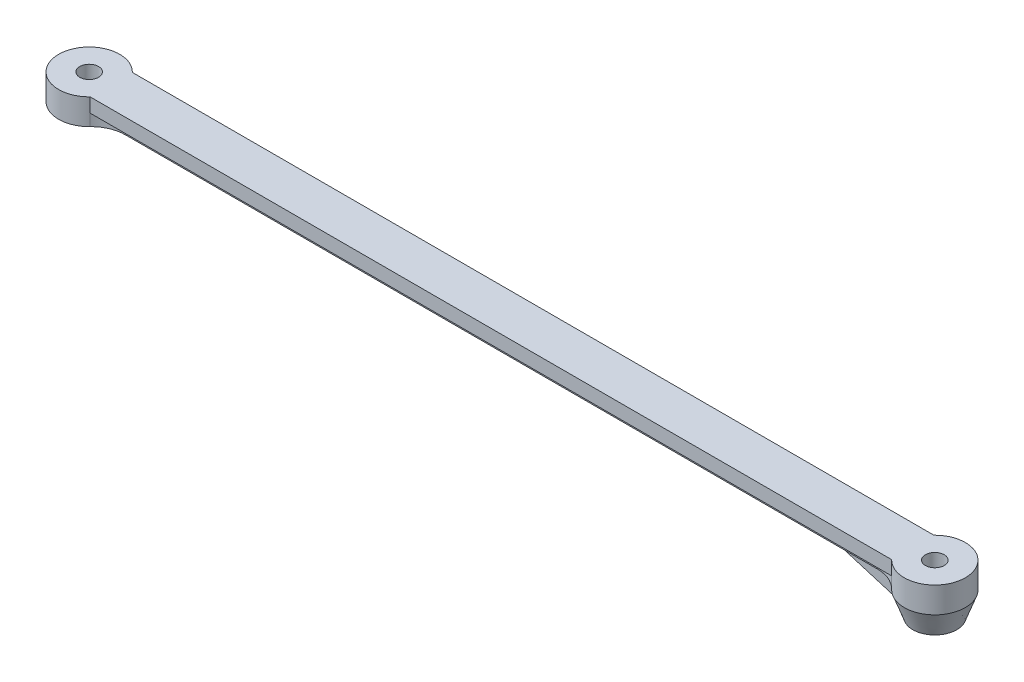
ISO-10303-21;
HEADER;
FILE_DESCRIPTION(('STEP AP214'),'2;1');
FILE_NAME('part.step','',(''),(''),'','','');
FILE_SCHEMA(('AUTOMOTIVE_DESIGN { 1 0 10303 214 1 1 1 1 }'));
ENDSEC;
DATA;
#1=APPLICATION_CONTEXT('core data for automotive mechanical design processes');
#2=APPLICATION_PROTOCOL_DEFINITION('international standard','automotive_design',2000,#1);
#3=PRODUCT_CONTEXT('',#1,'mechanical');
#4=PRODUCT('Part','Part','',(#3));
#5=PRODUCT_RELATED_PRODUCT_CATEGORY('part','',(#4));
#6=PRODUCT_DEFINITION_FORMATION('','',#4);
#7=PRODUCT_DEFINITION_CONTEXT('part definition',#1,'design');
#8=PRODUCT_DEFINITION('design','',#6,#7);
#9=PRODUCT_DEFINITION_SHAPE('','',#8);
#10=(LENGTH_UNIT() NAMED_UNIT(*) SI_UNIT(.MILLI.,.METRE.));
#11=(NAMED_UNIT(*) PLANE_ANGLE_UNIT() SI_UNIT($,.RADIAN.));
#12=(NAMED_UNIT(*) SI_UNIT($,.STERADIAN.) SOLID_ANGLE_UNIT());
#13=UNCERTAINTY_MEASURE_WITH_UNIT(LENGTH_MEASURE(1.E-05),#10,'distance_accuracy_value','');
#14=(GEOMETRIC_REPRESENTATION_CONTEXT(3) GLOBAL_UNCERTAINTY_ASSIGNED_CONTEXT((#13)) GLOBAL_UNIT_ASSIGNED_CONTEXT((#10,
#11,#12)) REPRESENTATION_CONTEXT('',''));
#15=CARTESIAN_POINT('',(0.,0.,0.));
#16=DIRECTION('',(0.,0.,1.));
#17=DIRECTION('',(1.,0.,0.));
#18=AXIS2_PLACEMENT_3D('',#15,#16,#17);
#19=CARTESIAN_POINT('',(-180.,0.,0.));
#20=DIRECTION('',(0.,1.,0.));
#21=DIRECTION('',(0.,0.,1.));
#22=AXIS2_PLACEMENT_3D('',#19,#20,#21);
#23=PLANE('',#22);
#24=CARTESIAN_POINT('',(-180.,0.,0.));
#25=DIRECTION('',(0.,1.,0.));
#26=DIRECTION('',(0.,0.,1.));
#27=AXIS2_PLACEMENT_3D('',#24,#25,#26);
#28=CIRCLE('',#27,2.);
#29=CARTESIAN_POINT('',(-180.,0.,2.));
#30=VERTEX_POINT('',#29);
#31=EDGE_CURVE('E262',#30,#30,#28,.T.);
#32=ORIENTED_EDGE('',*,*,#31,.T.);
#33=EDGE_LOOP('',(#32));
#34=FACE_BOUND('',#33,.T.);
#35=DIRECTION('',(-1.,0.,0.));
#36=VECTOR('',#35,1.);
#37=CARTESIAN_POINT('',(-3.08000003216462,0.,1.25));
#38=LINE('',#37,#36);
#39=CARTESIAN_POINT('',(-6.37929922012124,0.,1.25000003393927));
#40=VERTEX_POINT('',#39);
#41=CARTESIAN_POINT('',(-21.2800000321646,0.,1.25));
#42=VERTEX_POINT('',#41);
#43=EDGE_CURVE('E153',#40,#42,#38,.T.);
#44=ORIENTED_EDGE('',*,*,#43,.F.);
#45=CARTESIAN_POINT('',(0.,0.,0.));
#46=DIRECTION('',(0.,-1.,0.));
#47=DIRECTION('',(0.,0.,-1.));
#48=AXIS2_PLACEMENT_3D('',#45,#46,#47);
#49=CIRCLE('',#48,6.50000000000002);
#50=CARTESIAN_POINT('',(-4.69109029053926,0.,4.49929458046569));
#51=VERTEX_POINT('',#50);
#52=EDGE_CURVE('E231',#51,#40,#49,.T.);
#53=ORIENTED_EDGE('',*,*,#52,.F.);
#54=CARTESIAN_POINT('',(-9.96713348962479,0.,9.56249999999999));
#55=DIRECTION('',(0.,-1.,0.));
#56=DIRECTION('',(0.,0.,1.));
#57=AXIS2_PLACEMENT_3D('',#54,#55,#56);
#58=CIRCLE('',#57,7.3125);
#59=CARTESIAN_POINT('',(-9.9671334896248,0.,2.24999999999998));
#60=VERTEX_POINT('',#59);
#61=EDGE_CURVE('E257',#60,#51,#58,.T.);
#62=ORIENTED_EDGE('',*,*,#61,.F.);
#63=DIRECTION('',(1.,0.,0.));
#64=VECTOR('',#63,1.);
#65=CARTESIAN_POINT('',(-9.9671334896248,0.,2.24999999999998));
#66=LINE('',#65,#64);
#67=CARTESIAN_POINT('',(-170.032866510375,0.,2.24999999999999));
#68=VERTEX_POINT('',#67);
#69=EDGE_CURVE('E244',#68,#60,#66,.T.);
#70=ORIENTED_EDGE('',*,*,#69,.F.);
#71=CARTESIAN_POINT('',(-170.032866510375,0.,9.56250000000001));
#72=DIRECTION('',(0.,-1.,0.));
#73=DIRECTION('',(0.,0.,-1.));
#74=AXIS2_PLACEMENT_3D('',#71,#72,#73);
#75=CIRCLE('',#74,7.31250000000002);
#76=CARTESIAN_POINT('',(-175.309584240177,0.,4.49999999999997));
#77=VERTEX_POINT('',#76);
#78=EDGE_CURVE('E254',#77,#68,#75,.T.);
#79=ORIENTED_EDGE('',*,*,#78,.F.);
#80=CARTESIAN_POINT('',(-180.,0.,0.));
#81=DIRECTION('',(0.,1.,0.));
#82=DIRECTION('',(0.,0.,1.));
#83=AXIS2_PLACEMENT_3D('',#80,#81,#82);
#84=CIRCLE('',#83,6.5);
#85=CARTESIAN_POINT('',(-175.309584240177,0.,-4.5));
#86=VERTEX_POINT('',#85);
#87=EDGE_CURVE('E300',#86,#77,#84,.T.);
#88=ORIENTED_EDGE('',*,*,#87,.F.);
#89=CARTESIAN_POINT('',(-170.032866510375,0.,-9.56250000000001));
#90=DIRECTION('',(0.,-1.,0.));
#91=DIRECTION('',(0.,0.,1.));
#92=AXIS2_PLACEMENT_3D('',#89,#90,#91);
#93=CIRCLE('',#92,7.31249999999999);
#94=CARTESIAN_POINT('',(-170.032866510375,0.,-2.25000000000002));
#95=VERTEX_POINT('',#94);
#96=EDGE_CURVE('E271',#95,#86,#93,.T.);
#97=ORIENTED_EDGE('',*,*,#96,.F.);
#98=DIRECTION('',(-1.,0.,0.));
#99=VECTOR('',#98,1.);
#100=CARTESIAN_POINT('',(-9.96713348962481,0.,-2.25));
#101=LINE('',#100,#99);
#102=CARTESIAN_POINT('',(-9.96713348962481,0.,-2.25));
#103=VERTEX_POINT('',#102);
#104=EDGE_CURVE('E280',#103,#95,#101,.T.);
#105=ORIENTED_EDGE('',*,*,#104,.F.);
#106=CARTESIAN_POINT('',(-9.96713348962481,0.,-9.56250000000001));
#107=DIRECTION('',(0.,-1.,0.));
#108=DIRECTION('',(0.,0.,-1.));
#109=AXIS2_PLACEMENT_3D('',#106,#107,#108);
#110=CIRCLE('',#109,7.3125);
#111=CARTESIAN_POINT('',(-4.69043967413095,0.,-4.5000230141672));
#112=VERTEX_POINT('',#111);
#113=EDGE_CURVE('E283',#112,#103,#110,.T.);
#114=ORIENTED_EDGE('',*,*,#113,.F.);
#115=CARTESIAN_POINT('',(-6.37929766491854,0.,-1.24999989519081));
#116=VERTEX_POINT('',#115);
#117=EDGE_CURVE('E441',#116,#112,#49,.T.);
#118=ORIENTED_EDGE('',*,*,#117,.F.);
#119=DIRECTION('',(-1.,0.,0.));
#120=VECTOR('',#119,1.);
#121=CARTESIAN_POINT('',(-3.08000003216462,0.,-1.25));
#122=LINE('',#121,#120);
#123=CARTESIAN_POINT('',(-21.2800000321646,0.,-1.25));
#124=VERTEX_POINT('',#123);
#125=EDGE_CURVE('E60',#116,#124,#122,.T.);
#126=ORIENTED_EDGE('',*,*,#125,.T.);
#127=DIRECTION('',(0.,0.,-1.));
#128=VECTOR('',#127,1.);
#129=CARTESIAN_POINT('',(-21.2800000321646,0.,1.25));
#130=LINE('',#129,#128);
#131=EDGE_CURVE('E55',#42,#124,#130,.T.);
#132=ORIENTED_EDGE('',*,*,#131,.F.);
#133=EDGE_LOOP('',(#44,#53,#62,#70,#79,#88,#97,#105,#114,#118,#126,#132));
#134=FACE_BOUND('',#133,.T.);
#135=ADVANCED_FACE('F37',(#34,#134),#23,.F.);
#136=CARTESIAN_POINT('',(0.,-5.,0.));
#137=DIRECTION('',(0.,1.,0.));
#138=DIRECTION('',(0.,0.,1.));
#139=AXIS2_PLACEMENT_3D('',#136,#137,#138);
#140=CONICAL_SURFACE('',#139,4.68,0.349092133951805);
#141=ORIENTED_EDGE('',*,*,#52,.T.);
#142=CARTESIAN_POINT('',(-8.61696060219028,6.0636066150433,1.25));
#143=CARTESIAN_POINT('',(-8.43030599871527,5.55613704654127,1.25));
#144=CARTESIAN_POINT('',(-8.24354541919595,5.04870642478064,1.25));
#145=CARTESIAN_POINT('',(-7.86975365586061,4.03394459450432,1.25));
#146=CARTESIAN_POINT('',(-7.68272247191741,3.52661338603547,1.25));
#147=CARTESIAN_POINT('',(-7.12113302336583,2.00479571089433,1.25));
#148=CARTESIAN_POINT('',(-6.74608112908715,0.990491362462012,1.25));
#149=CARTESIAN_POINT('',(-5.99394719096289,-1.03719120662551,1.25));
#150=CARTESIAN_POINT('',(-5.61686546302824,-2.050569544232,1.25));
#151=CARTESIAN_POINT('',(-5.0484047572454,-3.56957808219935,1.25));
#152=CARTESIAN_POINT('',(-4.85844439697906,-4.07573892758262,1.25));
#153=CARTESIAN_POINT('',(-4.47717352196537,-5.08755181557813,1.25));
#154=CARTESIAN_POINT('',(-4.28586300894899,-5.59320385884175,1.25));
#155=CARTESIAN_POINT('',(-3.93533000225117,-6.51421680365429,1.25));
#156=CARTESIAN_POINT('',(-3.77642864896639,-6.92969985763672,1.25));
#157=CARTESIAN_POINT('',(-3.45669672968412,-7.75991555138109,1.25));
#158=CARTESIAN_POINT('',(-3.2958662024499,-8.1746482060289,1.25));
#159=CARTESIAN_POINT('',(-3.05239823007103,-8.79589610952701,1.25));
#160=CARTESIAN_POINT('',(-2.97086853759102,-9.00284523967557,1.25));
#161=CARTESIAN_POINT('',(-2.8068604047672,-9.41636576774358,1.25));
#162=CARTESIAN_POINT('',(-2.7243819711586,-9.62293716833253,1.25));
#163=CARTESIAN_POINT('',(-2.55820566485512,-10.0356052539102,1.25));
#164=CARTESIAN_POINT('',(-2.47450771668625,-10.2417019085957,1.25));
#165=CARTESIAN_POINT('',(-2.30544369253139,-10.6532150643155,1.25));
#166=CARTESIAN_POINT('',(-2.22007757573289,-10.8586315485651,1.25));
#167=CARTESIAN_POINT('',(-2.13365255737588,-11.0636066150433,1.25));
#168=B_SPLINE_CURVE_WITH_KNOTS('',3,(#142,#143,#144,#145,#146,#147,#148,#149,#150,#151,#152,
#153,#154,#155,#156,#157,#158,#159,#160,#161,#162,#163,#164,#165,#166,#167),.UNSPECIFIED.,.F.,
.F.,(4,2,2,2,2,2,2,2,2,2,2,2,4),(0.,1.6221244837254,3.24424973004629,6.48851993690394,
9.73229903789424,11.3541960353339,12.9760909537954,14.3105852786917,15.6450528340919,
16.3123405211941,16.9796234740758,17.6469479010328,18.314288674883),.UNSPECIFIED.);
#169=CARTESIAN_POINT('',(-4.50998168744277,-5.,1.24999907255157));
#170=VERTEX_POINT('',#169);
#171=EDGE_CURVE('E178',#40,#170,#168,.T.);
#172=ORIENTED_EDGE('',*,*,#171,.T.);
#173=CARTESIAN_POINT('',(0.,-5.,0.));
#174=DIRECTION('',(0.,-1.,0.));
#175=DIRECTION('',(0.,0.,-1.));
#176=AXIS2_PLACEMENT_3D('',#173,#174,#175);
#177=CIRCLE('',#176,4.68);
#178=CARTESIAN_POINT('',(-4.509974455259,-5.,-1.25));
#179=VERTEX_POINT('',#178);
#180=EDGE_CURVE('E169',#179,#170,#177,.T.);
#181=ORIENTED_EDGE('',*,*,#180,.F.);
#182=CARTESIAN_POINT('',(-8.61696060219028,6.06360661504331,-1.25));
#183=CARTESIAN_POINT('',(-8.43030599871527,5.55613704654127,-1.25));
#184=CARTESIAN_POINT('',(-8.24354541919595,5.04870642478064,-1.25));
#185=CARTESIAN_POINT('',(-7.86975365586061,4.03394459450432,-1.25));
#186=CARTESIAN_POINT('',(-7.68272247191741,3.52661338603547,-1.25));
#187=CARTESIAN_POINT('',(-7.12113302336583,2.00479571089433,-1.25));
#188=CARTESIAN_POINT('',(-6.74608112908715,0.990491362462013,-1.25));
#189=CARTESIAN_POINT('',(-5.99394719096289,-1.03719120662551,-1.25));
#190=CARTESIAN_POINT('',(-5.61686546302824,-2.050569544232,-1.25));
#191=CARTESIAN_POINT('',(-5.04840475724539,-3.56957808219935,-1.25));
#192=CARTESIAN_POINT('',(-4.85844439697906,-4.07573892758262,-1.25));
#193=CARTESIAN_POINT('',(-4.47717352196537,-5.08755181557814,-1.25));
#194=CARTESIAN_POINT('',(-4.28586300894899,-5.59320385884175,-1.25));
#195=CARTESIAN_POINT('',(-3.93533000225117,-6.51421680365429,-1.25));
#196=CARTESIAN_POINT('',(-3.77642864896639,-6.92969985763672,-1.25));
#197=CARTESIAN_POINT('',(-3.45669672968412,-7.75991555138109,-1.25));
#198=CARTESIAN_POINT('',(-3.2958662024499,-8.17464820602891,-1.25));
#199=CARTESIAN_POINT('',(-3.05239823007103,-8.79589610952701,-1.25));
#200=CARTESIAN_POINT('',(-2.97086853759101,-9.00284523967557,-1.25));
#201=CARTESIAN_POINT('',(-2.8068604047672,-9.41636576774359,-1.25));
#202=CARTESIAN_POINT('',(-2.7243819711586,-9.62293716833254,-1.25));
#203=CARTESIAN_POINT('',(-2.55820566485511,-10.0356052539102,-1.25));
#204=CARTESIAN_POINT('',(-2.47450771668625,-10.2417019085957,-1.25));
#205=CARTESIAN_POINT('',(-2.30544369253139,-10.6532150643155,-1.25));
#206=CARTESIAN_POINT('',(-2.22007757573289,-10.8586315485651,-1.25));
#207=CARTESIAN_POINT('',(-2.13365255737588,-11.0636066150433,-1.25));
#208=B_SPLINE_CURVE_WITH_KNOTS('',3,(#182,#183,#184,#185,#186,#187,#188,#189,#190,#191,#192,
#193,#194,#195,#196,#197,#198,#199,#200,#201,#202,#203,#204,#205,#206,#207),.UNSPECIFIED.,.F.,
.F.,(4,2,2,2,2,2,2,2,2,2,2,2,4),(0.,1.6221244837254,3.24424973004629,6.48851993690394,
9.73229903789424,11.3541960353339,12.9760909537954,14.3105852786917,15.645052834092,
16.3123405211941,16.9796234740758,17.6469479010328,18.314288674883),.UNSPECIFIED.);
#209=EDGE_CURVE('E192',#116,#179,#208,.T.);
#210=ORIENTED_EDGE('',*,*,#209,.F.);
#211=ORIENTED_EDGE('',*,*,#117,.T.);
#212=CARTESIAN_POINT('',(0.,0.,0.));
#213=DIRECTION('',(0.,-1.,0.));
#214=DIRECTION('',(0.,0.,-1.));
#215=AXIS2_PLACEMENT_3D('',#212,#213,#214);
#216=CIRCLE('',#215,6.50000000000001);
#217=EDGE_CURVE('E305',#51,#112,#216,.F.);
#218=ORIENTED_EDGE('',*,*,#217,.F.);
#219=EDGE_LOOP('',(#141,#172,#181,#210,#211,#218));
#220=FACE_BOUND('',#219,.T.);
#221=ADVANCED_FACE('F204',(#220),#140,.T.);
#222=CARTESIAN_POINT('',(-175.309584240177,5.5,-4.5));
#223=DIRECTION('',(0.,0.,1.));
#224=DIRECTION('',(1.,0.,0.));
#225=AXIS2_PLACEMENT_3D('',#222,#223,#224);
#226=PLANE('',#225);
#227=DIRECTION('',(1.,0.,0.));
#228=VECTOR('',#227,1.);
#229=CARTESIAN_POINT('',(-175.309584240177,2.5,-4.5));
#230=LINE('',#229,#228);
#231=CARTESIAN_POINT('',(-175.309584240177,2.5,-4.5));
#232=VERTEX_POINT('',#231);
#233=CARTESIAN_POINT('',(-4.69041575982347,2.5,-4.5));
#234=VERTEX_POINT('',#233);
#235=EDGE_CURVE('E276',#232,#234,#230,.T.);
#236=ORIENTED_EDGE('',*,*,#235,.F.);
#237=DIRECTION('',(0.,-1.,0.));
#238=VECTOR('',#237,1.);
#239=CARTESIAN_POINT('',(-175.309584240177,5.5,-4.5));
#240=LINE('',#239,#238);
#241=CARTESIAN_POINT('',(-175.309584240177,5.5,-4.5));
#242=VERTEX_POINT('',#241);
#243=EDGE_CURVE('E311',#242,#232,#240,.T.);
#244=ORIENTED_EDGE('',*,*,#243,.F.);
#245=DIRECTION('',(-1.,0.,0.));
#246=VECTOR('',#245,1.);
#247=CARTESIAN_POINT('',(-175.309584240177,5.5,-4.5));
#248=LINE('',#247,#246);
#249=CARTESIAN_POINT('',(-4.69041575982347,5.5,-4.5));
#250=VERTEX_POINT('',#249);
#251=EDGE_CURVE('E309',#250,#242,#248,.T.);
#252=ORIENTED_EDGE('',*,*,#251,.F.);
#253=DIRECTION('',(0.,-1.,0.));
#254=VECTOR('',#253,1.);
#255=CARTESIAN_POINT('',(-4.69041575982347,5.5,-4.5));
#256=LINE('',#255,#254);
#257=EDGE_CURVE('E316',#250,#234,#256,.T.);
#258=ORIENTED_EDGE('',*,*,#257,.T.);
#259=EDGE_LOOP('',(#236,#244,#252,#258));
#260=FACE_BOUND('',#259,.T.);
#261=ADVANCED_FACE('F359',(#260),#226,.F.);
#262=CARTESIAN_POINT('',(-180.,5.5,0.));
#263=DIRECTION('',(0.,1.,0.));
#264=DIRECTION('',(0.,0.,1.));
#265=AXIS2_PLACEMENT_3D('',#262,#263,#264);
#266=PLANE('',#265);
#267=CARTESIAN_POINT('',(0.,5.5,0.));
#268=DIRECTION('',(0.,1.,0.));
#269=DIRECTION('',(0.,0.,1.));
#270=AXIS2_PLACEMENT_3D('',#267,#268,#269);
#271=CIRCLE('',#270,2.);
#272=CARTESIAN_POINT('',(0.,5.5,2.));
#273=VERTEX_POINT('',#272);
#274=EDGE_CURVE('E295',#273,#273,#271,.T.);
#275=ORIENTED_EDGE('',*,*,#274,.F.);
#276=EDGE_LOOP('',(#275));
#277=FACE_BOUND('',#276,.T.);
#278=CARTESIAN_POINT('',(-180.,5.5,0.));
#279=DIRECTION('',(0.,1.,0.));
#280=DIRECTION('',(0.,0.,1.));
#281=AXIS2_PLACEMENT_3D('',#278,#279,#280);
#282=CIRCLE('',#281,6.5);
#283=CARTESIAN_POINT('',(-175.309584240177,5.5,4.5));
#284=VERTEX_POINT('',#283);
#285=EDGE_CURVE('E301',#242,#284,#282,.T.);
#286=ORIENTED_EDGE('',*,*,#285,.T.);
#287=DIRECTION('',(1.,0.,0.));
#288=VECTOR('',#287,1.);
#289=CARTESIAN_POINT('',(-175.309584240177,5.5,4.5));
#290=LINE('',#289,#288);
#291=CARTESIAN_POINT('',(-4.69041575982348,5.5,4.49999999999997));
#292=VERTEX_POINT('',#291);
#293=EDGE_CURVE('E304',#284,#292,#290,.T.);
#294=ORIENTED_EDGE('',*,*,#293,.T.);
#295=CARTESIAN_POINT('',(0.,5.5,0.));
#296=DIRECTION('',(0.,1.,0.));
#297=DIRECTION('',(0.,0.,1.));
#298=AXIS2_PLACEMENT_3D('',#295,#296,#297);
#299=CIRCLE('',#298,6.50000000000001);
#300=EDGE_CURVE('E307',#292,#250,#299,.T.);
#301=ORIENTED_EDGE('',*,*,#300,.T.);
#302=ORIENTED_EDGE('',*,*,#251,.T.);
#303=EDGE_LOOP('',(#286,#294,#301,#302));
#304=FACE_BOUND('',#303,.T.);
#305=CARTESIAN_POINT('',(-180.,5.5,0.));
#306=DIRECTION('',(0.,1.,0.));
#307=DIRECTION('',(0.,0.,1.));
#308=AXIS2_PLACEMENT_3D('',#305,#306,#307);
#309=CIRCLE('',#308,2.);
#310=CARTESIAN_POINT('',(-180.,5.5,2.));
#311=VERTEX_POINT('',#310);
#312=EDGE_CURVE('E292',#311,#311,#309,.T.);
#313=ORIENTED_EDGE('',*,*,#312,.F.);
#314=EDGE_LOOP('',(#313));
#315=FACE_BOUND('',#314,.T.);
#316=ADVANCED_FACE('F357',(#277,#304,#315),#266,.T.);
#317=CARTESIAN_POINT('',(-180.,5.5,0.));
#318=DIRECTION('',(0.,-1.,0.));
#319=DIRECTION('',(0.,0.,-1.));
#320=AXIS2_PLACEMENT_3D('',#317,#318,#319);
#321=CYLINDRICAL_SURFACE('',#320,6.5);
#322=ORIENTED_EDGE('',*,*,#87,.T.);
#323=DIRECTION('',(0.,-1.,0.));
#324=VECTOR('',#323,1.);
#325=CARTESIAN_POINT('',(-175.309584240177,2.5,4.49999999999997));
#326=LINE('',#325,#324);
#327=CARTESIAN_POINT('',(-175.309584240177,2.5,4.49999999999997));
#328=VERTEX_POINT('',#327);
#329=EDGE_CURVE('E265',#328,#77,#326,.T.);
#330=ORIENTED_EDGE('',*,*,#329,.F.);
#331=DIRECTION('',(0.,-1.,0.));
#332=VECTOR('',#331,1.);
#333=CARTESIAN_POINT('',(-175.309584240177,5.5,4.5));
#334=LINE('',#333,#332);
#335=EDGE_CURVE('E12',#284,#328,#334,.T.);
#336=ORIENTED_EDGE('',*,*,#335,.F.);
#337=ORIENTED_EDGE('',*,*,#285,.F.);
#338=ORIENTED_EDGE('',*,*,#243,.T.);
#339=DIRECTION('',(0.,-1.,0.));
#340=VECTOR('',#339,1.);
#341=CARTESIAN_POINT('',(-175.309584240177,2.5,-4.5));
#342=LINE('',#341,#340);
#343=EDGE_CURVE('E285',#232,#86,#342,.T.);
#344=ORIENTED_EDGE('',*,*,#343,.T.);
#345=EDGE_LOOP('',(#322,#330,#336,#337,#338,#344));
#346=FACE_BOUND('',#345,.T.);
#347=ADVANCED_FACE('F39',(#346),#321,.T.);
#348=CARTESIAN_POINT('',(-175.309584240177,5.5,4.5));
#349=DIRECTION('',(0.,0.,-1.));
#350=DIRECTION('',(-1.,0.,0.));
#351=AXIS2_PLACEMENT_3D('',#348,#349,#350);
#352=PLANE('',#351);
#353=ORIENTED_EDGE('',*,*,#335,.T.);
#354=DIRECTION('',(-1.,0.,0.));
#355=VECTOR('',#354,1.);
#356=CARTESIAN_POINT('',(-4.69041575982348,2.5,4.49999999999997));
#357=LINE('',#356,#355);
#358=CARTESIAN_POINT('',(-4.69041575982348,2.5,4.49999999999997));
#359=VERTEX_POINT('',#358);
#360=EDGE_CURVE('E243',#359,#328,#357,.T.);
#361=ORIENTED_EDGE('',*,*,#360,.F.);
#362=DIRECTION('',(0.,-1.,0.));
#363=VECTOR('',#362,1.);
#364=CARTESIAN_POINT('',(-4.69041575982348,5.5,4.49999999999997));
#365=LINE('',#364,#363);
#366=EDGE_CURVE('E47',#292,#359,#365,.T.);
#367=ORIENTED_EDGE('',*,*,#366,.F.);
#368=ORIENTED_EDGE('',*,*,#293,.F.);
#369=EDGE_LOOP('',(#353,#361,#367,#368));
#370=FACE_BOUND('',#369,.T.);
#371=ADVANCED_FACE('F366',(#370),#352,.F.);
#372=CARTESIAN_POINT('',(0.,5.5,0.));
#373=DIRECTION('',(0.,-1.,0.));
#374=DIRECTION('',(0.,0.,-1.));
#375=AXIS2_PLACEMENT_3D('',#372,#373,#374);
#376=CYLINDRICAL_SURFACE('',#375,6.50000000000001);
#377=ORIENTED_EDGE('',*,*,#217,.T.);
#378=DIRECTION('',(0.,-1.,0.));
#379=VECTOR('',#378,1.);
#380=CARTESIAN_POINT('',(-4.69041575982347,2.5,-4.5));
#381=LINE('',#380,#379);
#382=EDGE_CURVE('E288',#234,#112,#381,.T.);
#383=ORIENTED_EDGE('',*,*,#382,.F.);
#384=ORIENTED_EDGE('',*,*,#257,.F.);
#385=ORIENTED_EDGE('',*,*,#300,.F.);
#386=ORIENTED_EDGE('',*,*,#366,.T.);
#387=DIRECTION('',(0.,-1.,0.));
#388=VECTOR('',#387,1.);
#389=CARTESIAN_POINT('',(-4.69041575982348,2.5,4.49999999999997));
#390=LINE('',#389,#388);
#391=EDGE_CURVE('E253',#359,#51,#390,.T.);
#392=ORIENTED_EDGE('',*,*,#391,.T.);
#393=EDGE_LOOP('',(#377,#383,#384,#385,#386,#392));
#394=FACE_BOUND('',#393,.T.);
#395=ADVANCED_FACE('F363',(#394),#376,.T.);
#396=CARTESIAN_POINT('',(0.,5.5,0.));
#397=DIRECTION('',(0.,-1.,0.));
#398=DIRECTION('',(0.,0.,-1.));
#399=AXIS2_PLACEMENT_3D('',#396,#397,#398);
#400=CYLINDRICAL_SURFACE('',#399,2.);
#401=ORIENTED_EDGE('',*,*,#274,.T.);
#402=EDGE_LOOP('',(#401));
#403=FACE_BOUND('',#402,.T.);
#404=CARTESIAN_POINT('',(0.,-5.,0.));
#405=DIRECTION('',(0.,-1.,0.));
#406=DIRECTION('',(0.,0.,-1.));
#407=AXIS2_PLACEMENT_3D('',#404,#405,#406);
#408=CIRCLE('',#407,2.);
#409=CARTESIAN_POINT('',(0.,-5.,-2.));
#410=VERTEX_POINT('',#409);
#411=EDGE_CURVE('E440',#410,#410,#408,.T.);
#412=ORIENTED_EDGE('',*,*,#411,.T.);
#413=EDGE_LOOP('',(#412));
#414=FACE_BOUND('',#413,.T.);
#415=ADVANCED_FACE('F365',(#403,#414),#400,.F.);
#416=CARTESIAN_POINT('',(-180.,5.5,0.));
#417=DIRECTION('',(0.,-1.,0.));
#418=DIRECTION('',(0.,0.,-1.));
#419=AXIS2_PLACEMENT_3D('',#416,#417,#418);
#420=CYLINDRICAL_SURFACE('',#419,2.);
#421=ORIENTED_EDGE('',*,*,#312,.T.);
#422=EDGE_LOOP('',(#421));
#423=FACE_BOUND('',#422,.T.);
#424=ORIENTED_EDGE('',*,*,#31,.F.);
#425=EDGE_LOOP('',(#424));
#426=FACE_BOUND('',#425,.T.);
#427=ADVANCED_FACE('F429',(#423,#426),#420,.F.);
#428=CARTESIAN_POINT('',(-9.96713348962481,2.5,-9.56250000000001));
#429=DIRECTION('',(0.,-1.,0.));
#430=DIRECTION('',(0.,0.,-1.));
#431=AXIS2_PLACEMENT_3D('',#428,#429,#430);
#432=CYLINDRICAL_SURFACE('',#431,7.3125);
#433=ORIENTED_EDGE('',*,*,#113,.T.);
#434=DIRECTION('',(0.,-1.,0.));
#435=VECTOR('',#434,1.);
#436=CARTESIAN_POINT('',(-9.96713348962481,2.5,-2.25));
#437=LINE('',#436,#435);
#438=CARTESIAN_POINT('',(-9.96713348962481,2.5,-2.25));
#439=VERTEX_POINT('',#438);
#440=EDGE_CURVE('E279',#439,#103,#437,.T.);
#441=ORIENTED_EDGE('',*,*,#440,.F.);
#442=CARTESIAN_POINT('',(-9.96713348962481,2.5,-9.56250000000001));
#443=DIRECTION('',(0.,-1.,0.));
#444=DIRECTION('',(0.,0.,-1.));
#445=AXIS2_PLACEMENT_3D('',#442,#443,#444);
#446=CIRCLE('',#445,7.3125);
#447=EDGE_CURVE('E267',#234,#439,#446,.T.);
#448=ORIENTED_EDGE('',*,*,#447,.F.);
#449=ORIENTED_EDGE('',*,*,#382,.T.);
#450=EDGE_LOOP('',(#433,#441,#448,#449));
#451=FACE_BOUND('',#450,.T.);
#452=ADVANCED_FACE('F412',(#451),#432,.F.);
#453=CARTESIAN_POINT('',(-170.032866510375,2.5,-9.56250000000001));
#454=DIRECTION('',(0.,-1.,0.));
#455=DIRECTION('',(0.,0.,-1.));
#456=AXIS2_PLACEMENT_3D('',#453,#454,#455);
#457=CYLINDRICAL_SURFACE('',#456,7.31249999999999);
#458=ORIENTED_EDGE('',*,*,#96,.T.);
#459=ORIENTED_EDGE('',*,*,#343,.F.);
#460=CARTESIAN_POINT('',(-170.032866510375,2.5,-9.56250000000001));
#461=DIRECTION('',(0.,-1.,0.));
#462=DIRECTION('',(0.,0.,1.));
#463=AXIS2_PLACEMENT_3D('',#460,#461,#462);
#464=CIRCLE('',#463,7.31249999999999);
#465=CARTESIAN_POINT('',(-170.032866510375,2.5,-2.25000000000002));
#466=VERTEX_POINT('',#465);
#467=EDGE_CURVE('E274',#466,#232,#464,.T.);
#468=ORIENTED_EDGE('',*,*,#467,.F.);
#469=DIRECTION('',(0.,-1.,0.));
#470=VECTOR('',#469,1.);
#471=CARTESIAN_POINT('',(-170.032866510375,2.5,-2.25000000000002));
#472=LINE('',#471,#470);
#473=EDGE_CURVE('E289',#466,#95,#472,.T.);
#474=ORIENTED_EDGE('',*,*,#473,.T.);
#475=EDGE_LOOP('',(#458,#459,#468,#474));
#476=FACE_BOUND('',#475,.T.);
#477=ADVANCED_FACE('F405',(#476),#457,.F.);
#478=CARTESIAN_POINT('',(-9.96713348962481,2.5,-2.25));
#479=DIRECTION('',(0.,0.,1.));
#480=DIRECTION('',(1.,0.,0.));
#481=AXIS2_PLACEMENT_3D('',#478,#479,#480);
#482=PLANE('',#481);
#483=ORIENTED_EDGE('',*,*,#104,.T.);
#484=ORIENTED_EDGE('',*,*,#473,.F.);
#485=DIRECTION('',(-1.,0.,0.));
#486=VECTOR('',#485,1.);
#487=CARTESIAN_POINT('',(-9.96713348962481,2.5,-2.25));
#488=LINE('',#487,#486);
#489=EDGE_CURVE('E270',#439,#466,#488,.T.);
#490=ORIENTED_EDGE('',*,*,#489,.F.);
#491=ORIENTED_EDGE('',*,*,#440,.T.);
#492=EDGE_LOOP('',(#483,#484,#490,#491));
#493=FACE_BOUND('',#492,.T.);
#494=ADVANCED_FACE('F409',(#493),#482,.F.);
#495=CARTESIAN_POINT('',(-9.96713348962481,2.5,-9.56250000000001));
#496=DIRECTION('',(0.,-1.,0.));
#497=DIRECTION('',(0.,0.,-1.));
#498=AXIS2_PLACEMENT_3D('',#495,#496,#497);
#499=PLANE('',#498);
#500=ORIENTED_EDGE('',*,*,#447,.T.);
#501=ORIENTED_EDGE('',*,*,#489,.T.);
#502=ORIENTED_EDGE('',*,*,#467,.T.);
#503=ORIENTED_EDGE('',*,*,#235,.T.);
#504=EDGE_LOOP('',(#500,#501,#502,#503));
#505=FACE_BOUND('',#504,.T.);
#506=ADVANCED_FACE('F414',(#505),#499,.T.);
#507=CARTESIAN_POINT('',(-9.96713348962479,2.5,9.56249999999999));
#508=DIRECTION('',(0.,-1.,0.));
#509=DIRECTION('',(0.,0.,-1.));
#510=AXIS2_PLACEMENT_3D('',#507,#508,#509);
#511=CYLINDRICAL_SURFACE('',#510,7.3125);
#512=ORIENTED_EDGE('',*,*,#61,.T.);
#513=ORIENTED_EDGE('',*,*,#391,.F.);
#514=CARTESIAN_POINT('',(-9.96713348962479,2.5,9.56249999999999));
#515=DIRECTION('',(0.,-1.,0.));
#516=DIRECTION('',(0.,0.,1.));
#517=AXIS2_PLACEMENT_3D('',#514,#515,#516);
#518=CIRCLE('',#517,7.3125);
#519=CARTESIAN_POINT('',(-9.9671334896248,2.5,2.24999999999998));
#520=VERTEX_POINT('',#519);
#521=EDGE_CURVE('E239',#520,#359,#518,.T.);
#522=ORIENTED_EDGE('',*,*,#521,.F.);
#523=DIRECTION('',(0.,-1.,0.));
#524=VECTOR('',#523,1.);
#525=CARTESIAN_POINT('',(-9.9671334896248,2.5,2.24999999999998));
#526=LINE('',#525,#524);
#527=EDGE_CURVE('E260',#520,#60,#526,.T.);
#528=ORIENTED_EDGE('',*,*,#527,.T.);
#529=EDGE_LOOP('',(#512,#513,#522,#528));
#530=FACE_BOUND('',#529,.T.);
#531=ADVANCED_FACE('F392',(#530),#511,.F.);
#532=CARTESIAN_POINT('',(-9.9671334896248,2.5,2.24999999999998));
#533=DIRECTION('',(0.,0.,-1.));
#534=DIRECTION('',(-1.,0.,0.));
#535=AXIS2_PLACEMENT_3D('',#532,#533,#534);
#536=PLANE('',#535);
#537=ORIENTED_EDGE('',*,*,#69,.T.);
#538=ORIENTED_EDGE('',*,*,#527,.F.);
#539=DIRECTION('',(1.,0.,0.));
#540=VECTOR('',#539,1.);
#541=CARTESIAN_POINT('',(-9.9671334896248,2.5,2.24999999999998));
#542=LINE('',#541,#540);
#543=CARTESIAN_POINT('',(-170.032866510375,2.5,2.24999999999999));
#544=VERTEX_POINT('',#543);
#545=EDGE_CURVE('E250',#544,#520,#542,.T.);
#546=ORIENTED_EDGE('',*,*,#545,.F.);
#547=DIRECTION('',(0.,-1.,0.));
#548=VECTOR('',#547,1.);
#549=CARTESIAN_POINT('',(-170.032866510375,2.5,2.24999999999999));
#550=LINE('',#549,#548);
#551=EDGE_CURVE('E263',#544,#68,#550,.T.);
#552=ORIENTED_EDGE('',*,*,#551,.T.);
#553=EDGE_LOOP('',(#537,#538,#546,#552));
#554=FACE_BOUND('',#553,.T.);
#555=ADVANCED_FACE('F386',(#554),#536,.F.);
#556=CARTESIAN_POINT('',(-170.032866510375,2.5,9.56250000000001));
#557=DIRECTION('',(0.,-1.,0.));
#558=DIRECTION('',(0.,0.,-1.));
#559=AXIS2_PLACEMENT_3D('',#556,#557,#558);
#560=CYLINDRICAL_SURFACE('',#559,7.31250000000002);
#561=ORIENTED_EDGE('',*,*,#78,.T.);
#562=ORIENTED_EDGE('',*,*,#551,.F.);
#563=CARTESIAN_POINT('',(-170.032866510375,2.5,9.56250000000001));
#564=DIRECTION('',(0.,-1.,0.));
#565=DIRECTION('',(0.,0.,-1.));
#566=AXIS2_PLACEMENT_3D('',#563,#564,#565);
#567=CIRCLE('',#566,7.31250000000002);
#568=EDGE_CURVE('E247',#328,#544,#567,.T.);
#569=ORIENTED_EDGE('',*,*,#568,.F.);
#570=ORIENTED_EDGE('',*,*,#329,.T.);
#571=EDGE_LOOP('',(#561,#562,#569,#570));
#572=FACE_BOUND('',#571,.T.);
#573=ADVANCED_FACE('F382',(#572),#560,.F.);
#574=CARTESIAN_POINT('',(-9.96713348962479,2.5,9.56249999999999));
#575=DIRECTION('',(0.,1.,0.));
#576=DIRECTION('',(0.,0.,1.));
#577=AXIS2_PLACEMENT_3D('',#574,#575,#576);
#578=PLANE('',#577);
#579=ORIENTED_EDGE('',*,*,#521,.T.);
#580=ORIENTED_EDGE('',*,*,#360,.T.);
#581=ORIENTED_EDGE('',*,*,#568,.T.);
#582=ORIENTED_EDGE('',*,*,#545,.T.);
#583=EDGE_LOOP('',(#579,#580,#581,#582));
#584=FACE_BOUND('',#583,.T.);
#585=ADVANCED_FACE('F390',(#584),#578,.F.);
#586=CARTESIAN_POINT('',(0.,-5.,0.));
#587=DIRECTION('',(0.,-1.,0.));
#588=DIRECTION('',(0.,0.,-1.));
#589=AXIS2_PLACEMENT_3D('',#586,#587,#588);
#590=PLANE('',#589);
#591=ORIENTED_EDGE('',*,*,#180,.T.);
#592=DIRECTION('',(1.,0.,0.));
#593=VECTOR('',#592,1.);
#594=CARTESIAN_POINT('',(-4.68000003216462,-5.,1.25));
#595=LINE('',#594,#593);
#596=CARTESIAN_POINT('',(-4.68000003216462,-5.,1.25));
#597=VERTEX_POINT('',#596);
#598=EDGE_CURVE('E152',#597,#170,#595,.T.);
#599=ORIENTED_EDGE('',*,*,#598,.F.);
#600=DIRECTION('',(0.,0.,-1.));
#601=VECTOR('',#600,1.);
#602=CARTESIAN_POINT('',(-4.68000003216462,-5.,1.25));
#603=LINE('',#602,#601);
#604=CARTESIAN_POINT('',(-4.68,-5.,0.));
#605=VERTEX_POINT('',#604);
#606=EDGE_CURVE('E157',#597,#605,#603,.T.);
#607=ORIENTED_EDGE('',*,*,#606,.T.);
#608=CARTESIAN_POINT('',(-4.68000000007652,-5.,-0.000547383270467899));
#609=VERTEX_POINT('',#608);
#610=EDGE_CURVE('E41',#605,#609,#177,.T.);
#611=ORIENTED_EDGE('',*,*,#610,.T.);
#612=CARTESIAN_POINT('',(-4.68000003216462,-5.,-1.25));
#613=VERTEX_POINT('',#612);
#614=EDGE_CURVE('E163',#609,#613,#603,.T.);
#615=ORIENTED_EDGE('',*,*,#614,.T.);
#616=DIRECTION('',(1.,0.,0.));
#617=VECTOR('',#616,1.);
#618=CARTESIAN_POINT('',(-4.68000003216462,-5.,-1.25));
#619=LINE('',#618,#617);
#620=EDGE_CURVE('E190',#613,#179,#619,.T.);
#621=ORIENTED_EDGE('',*,*,#620,.T.);
#622=EDGE_LOOP('',(#591,#599,#607,#611,#615,#621));
#623=FACE_BOUND('',#622,.T.);
#624=ORIENTED_EDGE('',*,*,#411,.F.);
#625=EDGE_LOOP('',(#624));
#626=FACE_BOUND('',#625,.T.);
#627=ADVANCED_FACE('F166',(#623,#626),#590,.T.);
#628=CARTESIAN_POINT('',(-21.2800000321646,0.,1.25));
#629=DIRECTION('',(0.288406081085565,0.957508189204075,0.));
#630=DIRECTION('',(-0.957508189204075,0.288406081085565,0.));
#631=AXIS2_PLACEMENT_3D('',#628,#629,#630);
#632=PLANE('',#631);
#633=DIRECTION('',(0.957508189204075,-0.288406081085565,0.));
#634=VECTOR('',#633,1.);
#635=CARTESIAN_POINT('',(-21.2800000321646,0.,-1.25));
#636=LINE('',#635,#634);
#637=EDGE_CURVE('E184',#124,#613,#636,.T.);
#638=ORIENTED_EDGE('',*,*,#637,.T.);
#639=ORIENTED_EDGE('',*,*,#614,.F.);
#640=ORIENTED_EDGE('',*,*,#610,.F.);
#641=ORIENTED_EDGE('',*,*,#606,.F.);
#642=DIRECTION('',(0.957508189204075,-0.288406081085565,0.));
#643=VECTOR('',#642,1.);
#644=CARTESIAN_POINT('',(-21.2800000321646,0.,1.25));
#645=LINE('',#644,#643);
#646=EDGE_CURVE('E147',#42,#597,#645,.T.);
#647=ORIENTED_EDGE('',*,*,#646,.F.);
#648=ORIENTED_EDGE('',*,*,#131,.T.);
#649=EDGE_LOOP('',(#638,#639,#640,#641,#647,#648));
#650=FACE_BOUND('',#649,.T.);
#651=ADVANCED_FACE('F159',(#650),#632,.F.);
#652=CARTESIAN_POINT('',(0.,0.,1.25));
#653=DIRECTION('',(0.,0.,-1.));
#654=DIRECTION('',(-1.,0.,0.));
#655=AXIS2_PLACEMENT_3D('',#652,#653,#654);
#656=PLANE('',#655);
#657=ORIENTED_EDGE('',*,*,#171,.F.);
#658=ORIENTED_EDGE('',*,*,#43,.T.);
#659=ORIENTED_EDGE('',*,*,#646,.T.);
#660=ORIENTED_EDGE('',*,*,#598,.T.);
#661=EDGE_LOOP('',(#657,#658,#659,#660));
#662=FACE_BOUND('',#661,.T.);
#663=ADVANCED_FACE('F150',(#662),#656,.F.);
#664=CARTESIAN_POINT('',(0.,0.,-1.25));
#665=DIRECTION('',(0.,0.,-1.));
#666=DIRECTION('',(-1.,0.,0.));
#667=AXIS2_PLACEMENT_3D('',#664,#665,#666);
#668=PLANE('',#667);
#669=ORIENTED_EDGE('',*,*,#125,.F.);
#670=ORIENTED_EDGE('',*,*,#209,.T.);
#671=ORIENTED_EDGE('',*,*,#620,.F.);
#672=ORIENTED_EDGE('',*,*,#637,.F.);
#673=EDGE_LOOP('',(#669,#670,#671,#672));
#674=FACE_BOUND('',#673,.T.);
#675=ADVANCED_FACE('F211',(#674),#668,.T.);
#676=CLOSED_SHELL('',(#135,#221,#261,#316,#347,#371,#395,#415,#427,#452,#477,#494,#506,#531,
#555,#573,#585,#627,#651,#663,#675));
#677=MANIFOLD_SOLID_BREP('B2',#676);
#678=ADVANCED_BREP_SHAPE_REPRESENTATION('',(#18,#677),#14);
#679=SHAPE_DEFINITION_REPRESENTATION(#9,#678);
ENDSEC;
END-ISO-10303-21;
